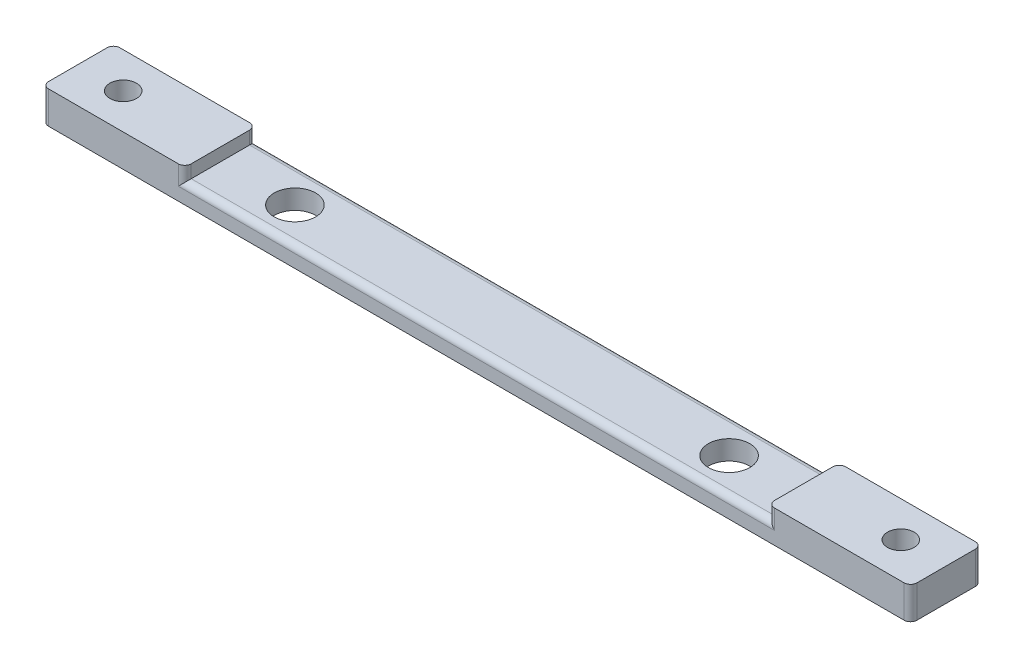
ISO-10303-21;
HEADER;
FILE_DESCRIPTION(('STEP AP214'),'2;1');
FILE_NAME('part.step','',(''),(''),'','','');
FILE_SCHEMA(('AUTOMOTIVE_DESIGN { 1 0 10303 214 1 1 1 1 }'));
ENDSEC;
DATA;
#1=APPLICATION_CONTEXT('core data for automotive mechanical design processes');
#2=APPLICATION_PROTOCOL_DEFINITION('international standard','automotive_design',2000,#1);
#3=PRODUCT_CONTEXT('',#1,'mechanical');
#4=PRODUCT('Part','Part','',(#3));
#5=PRODUCT_RELATED_PRODUCT_CATEGORY('part','',(#4));
#6=PRODUCT_DEFINITION_FORMATION('','',#4);
#7=PRODUCT_DEFINITION_CONTEXT('part definition',#1,'design');
#8=PRODUCT_DEFINITION('design','',#6,#7);
#9=PRODUCT_DEFINITION_SHAPE('','',#8);
#10=(LENGTH_UNIT() NAMED_UNIT(*) SI_UNIT(.MILLI.,.METRE.));
#11=(NAMED_UNIT(*) PLANE_ANGLE_UNIT() SI_UNIT($,.RADIAN.));
#12=(NAMED_UNIT(*) SI_UNIT($,.STERADIAN.) SOLID_ANGLE_UNIT());
#13=UNCERTAINTY_MEASURE_WITH_UNIT(LENGTH_MEASURE(1.E-05),#10,'distance_accuracy_value','');
#14=(GEOMETRIC_REPRESENTATION_CONTEXT(3) GLOBAL_UNCERTAINTY_ASSIGNED_CONTEXT((#13)) GLOBAL_UNIT_ASSIGNED_CONTEXT((#10,
#11,#12)) REPRESENTATION_CONTEXT('',''));
#15=CARTESIAN_POINT('',(0.,0.,0.));
#16=DIRECTION('',(0.,0.,1.));
#17=DIRECTION('',(1.,0.,0.));
#18=AXIS2_PLACEMENT_3D('',#15,#16,#17);
#19=CARTESIAN_POINT('',(66.,5.,-1.00000000000002));
#20=DIRECTION('',(0.,1.,0.));
#21=DIRECTION('',(0.,0.,1.));
#22=AXIS2_PLACEMENT_3D('',#19,#20,#21);
#23=PLANE('',#22);
#24=CARTESIAN_POINT('',(60.,5.,-5.50000000000002));
#25=DIRECTION('',(0.,1.,0.));
#26=DIRECTION('',(0.,0.,1.));
#27=AXIS2_PLACEMENT_3D('',#24,#25,#26);
#28=CIRCLE('',#27,2.04999999999999);
#29=CARTESIAN_POINT('',(60.,5.,-3.45000000000002));
#30=VERTEX_POINT('',#29);
#31=EDGE_CURVE('E255',#30,#30,#28,.T.);
#32=ORIENTED_EDGE('',*,*,#31,.F.);
#33=EDGE_LOOP('',(#32));
#34=FACE_BOUND('',#33,.T.);
#35=DIRECTION('',(-1.,0.,0.));
#36=VECTOR('',#35,1.);
#37=CARTESIAN_POINT('',(66.,5.,-11.));
#38=LINE('',#37,#36);
#39=CARTESIAN_POINT('',(66.,5.,-11.));
#40=VERTEX_POINT('',#39);
#41=CARTESIAN_POINT('',(46.,5.,-11.));
#42=VERTEX_POINT('',#41);
#43=EDGE_CURVE('E284',#40,#42,#38,.T.);
#44=ORIENTED_EDGE('',*,*,#43,.T.);
#45=CARTESIAN_POINT('',(46.,5.,-9.99999999999998));
#46=DIRECTION('',(0.,1.,0.));
#47=DIRECTION('',(0.,0.,1.));
#48=AXIS2_PLACEMENT_3D('',#45,#46,#47);
#49=CIRCLE('',#48,1.);
#50=CARTESIAN_POINT('',(45.,5.,-9.99999999999998));
#51=VERTEX_POINT('',#50);
#52=EDGE_CURVE('E204',#42,#51,#49,.T.);
#53=ORIENTED_EDGE('',*,*,#52,.T.);
#54=DIRECTION('',(0.,0.,1.));
#55=VECTOR('',#54,1.);
#56=CARTESIAN_POINT('',(45.,5.,-11.));
#57=LINE('',#56,#55);
#58=CARTESIAN_POINT('',(45.,5.,-1.00000000000002));
#59=VERTEX_POINT('',#58);
#60=EDGE_CURVE('E332',#51,#59,#57,.T.);
#61=ORIENTED_EDGE('',*,*,#60,.T.);
#62=CARTESIAN_POINT('',(46.,5.,-1.00000000000002));
#63=DIRECTION('',(0.,1.,0.));
#64=DIRECTION('',(0.,0.,1.));
#65=AXIS2_PLACEMENT_3D('',#62,#63,#64);
#66=CIRCLE('',#65,1.);
#67=CARTESIAN_POINT('',(46.,5.,0.));
#68=VERTEX_POINT('',#67);
#69=EDGE_CURVE('E202',#59,#68,#66,.T.);
#70=ORIENTED_EDGE('',*,*,#69,.T.);
#71=DIRECTION('',(1.,0.,0.));
#72=VECTOR('',#71,1.);
#73=CARTESIAN_POINT('',(-66.,5.,0.));
#74=LINE('',#73,#72);
#75=CARTESIAN_POINT('',(66.,5.,0.));
#76=VERTEX_POINT('',#75);
#77=EDGE_CURVE('E168',#68,#76,#74,.T.);
#78=ORIENTED_EDGE('',*,*,#77,.T.);
#79=CARTESIAN_POINT('',(66.,5.,-1.00000000000002));
#80=DIRECTION('',(0.,1.,0.));
#81=DIRECTION('',(0.,0.,1.));
#82=AXIS2_PLACEMENT_3D('',#79,#80,#81);
#83=CIRCLE('',#82,1.);
#84=CARTESIAN_POINT('',(67.,5.,-1.00000000000002));
#85=VERTEX_POINT('',#84);
#86=EDGE_CURVE('E163',#76,#85,#83,.T.);
#87=ORIENTED_EDGE('',*,*,#86,.T.);
#88=DIRECTION('',(0.,0.,-1.));
#89=VECTOR('',#88,1.);
#90=CARTESIAN_POINT('',(67.,5.,-1.00000000000002));
#91=LINE('',#90,#89);
#92=CARTESIAN_POINT('',(67.,5.,-9.99999999999998));
#93=VERTEX_POINT('',#92);
#94=EDGE_CURVE('E152',#85,#93,#91,.T.);
#95=ORIENTED_EDGE('',*,*,#94,.T.);
#96=CARTESIAN_POINT('',(66.,5.,-9.99999999999998));
#97=DIRECTION('',(0.,1.,0.));
#98=DIRECTION('',(0.,0.,1.));
#99=AXIS2_PLACEMENT_3D('',#96,#97,#98);
#100=CIRCLE('',#99,1.);
#101=EDGE_CURVE('E162',#93,#40,#100,.T.);
#102=ORIENTED_EDGE('',*,*,#101,.T.);
#103=EDGE_LOOP('',(#44,#53,#61,#70,#78,#87,#95,#102));
#104=FACE_BOUND('',#103,.T.);
#105=ADVANCED_FACE('F37',(#34,#104),#23,.T.);
#106=DIRECTION('',(0.,0.,1.));
#107=VECTOR('',#106,1.);
#108=CARTESIAN_POINT('',(-45.,5.,-11.));
#109=LINE('',#108,#107);
#110=CARTESIAN_POINT('',(-45.,5.,-9.99999999999998));
#111=VERTEX_POINT('',#110);
#112=CARTESIAN_POINT('',(-45.,5.,-1.00000000000002));
#113=VERTEX_POINT('',#112);
#114=EDGE_CURVE('E188',#111,#113,#109,.T.);
#115=ORIENTED_EDGE('',*,*,#114,.F.);
#116=CARTESIAN_POINT('',(-46.,5.,-9.99999999999998));
#117=DIRECTION('',(0.,1.,0.));
#118=DIRECTION('',(0.,0.,1.));
#119=AXIS2_PLACEMENT_3D('',#116,#117,#118);
#120=CIRCLE('',#119,1.);
#121=CARTESIAN_POINT('',(-46.,5.,-11.));
#122=VERTEX_POINT('',#121);
#123=EDGE_CURVE('E11',#111,#122,#120,.T.);
#124=ORIENTED_EDGE('',*,*,#123,.T.);
#125=CARTESIAN_POINT('',(-66.,5.,-11.));
#126=VERTEX_POINT('',#125);
#127=EDGE_CURVE('E306',#122,#126,#38,.T.);
#128=ORIENTED_EDGE('',*,*,#127,.T.);
#129=CARTESIAN_POINT('',(-66.,5.,-9.99999999999998));
#130=DIRECTION('',(0.,1.,0.));
#131=DIRECTION('',(0.,0.,-1.));
#132=AXIS2_PLACEMENT_3D('',#129,#130,#131);
#133=CIRCLE('',#132,1.);
#134=CARTESIAN_POINT('',(-67.,5.,-9.99999999999998));
#135=VERTEX_POINT('',#134);
#136=EDGE_CURVE('E302',#126,#135,#133,.T.);
#137=ORIENTED_EDGE('',*,*,#136,.T.);
#138=DIRECTION('',(0.,0.,1.));
#139=VECTOR('',#138,1.);
#140=CARTESIAN_POINT('',(-67.,5.,-1.00000000000002));
#141=LINE('',#140,#139);
#142=CARTESIAN_POINT('',(-67.,5.,-1.00000000000002));
#143=VERTEX_POINT('',#142);
#144=EDGE_CURVE('E301',#135,#143,#141,.T.);
#145=ORIENTED_EDGE('',*,*,#144,.T.);
#146=CARTESIAN_POINT('',(-66.,5.,-1.00000000000002));
#147=DIRECTION('',(0.,1.,0.));
#148=DIRECTION('',(0.,0.,-1.));
#149=AXIS2_PLACEMENT_3D('',#146,#147,#148);
#150=CIRCLE('',#149,1.);
#151=CARTESIAN_POINT('',(-66.,5.,0.));
#152=VERTEX_POINT('',#151);
#153=EDGE_CURVE('E244',#143,#152,#150,.T.);
#154=ORIENTED_EDGE('',*,*,#153,.T.);
#155=CARTESIAN_POINT('',(-46.,5.,0.));
#156=VERTEX_POINT('',#155);
#157=EDGE_CURVE('E240',#152,#156,#74,.T.);
#158=ORIENTED_EDGE('',*,*,#157,.T.);
#159=CARTESIAN_POINT('',(-46.,5.,-1.00000000000002));
#160=DIRECTION('',(0.,1.,0.));
#161=DIRECTION('',(0.,0.,1.));
#162=AXIS2_PLACEMENT_3D('',#159,#160,#161);
#163=CIRCLE('',#162,1.);
#164=EDGE_CURVE('E46',#156,#113,#163,.T.);
#165=ORIENTED_EDGE('',*,*,#164,.T.);
#166=EDGE_LOOP('',(#115,#124,#128,#137,#145,#154,#158,#165));
#167=FACE_BOUND('',#166,.T.);
#168=CARTESIAN_POINT('',(-60.,5.,-5.50000000000002));
#169=DIRECTION('',(0.,1.,0.));
#170=DIRECTION('',(0.,0.,-1.));
#171=AXIS2_PLACEMENT_3D('',#168,#169,#170);
#172=CIRCLE('',#171,2.04999999999999);
#173=CARTESIAN_POINT('',(-60.,5.,-7.55000000000001));
#174=VERTEX_POINT('',#173);
#175=EDGE_CURVE('E319',#174,#174,#172,.T.);
#176=ORIENTED_EDGE('',*,*,#175,.F.);
#177=EDGE_LOOP('',(#176));
#178=FACE_BOUND('',#177,.T.);
#179=ADVANCED_FACE('F241',(#167,#178),#23,.T.);
#180=CARTESIAN_POINT('',(66.,0.,-1.00000000000002));
#181=DIRECTION('',(0.,1.,0.));
#182=DIRECTION('',(0.,0.,1.));
#183=AXIS2_PLACEMENT_3D('',#180,#181,#182);
#184=PLANE('',#183);
#185=CARTESIAN_POINT('',(66.,0.,-1.00000000000002));
#186=DIRECTION('',(0.,1.,0.));
#187=DIRECTION('',(0.,0.,1.));
#188=AXIS2_PLACEMENT_3D('',#185,#186,#187);
#189=CIRCLE('',#188,1.);
#190=CARTESIAN_POINT('',(66.,0.,0.));
#191=VERTEX_POINT('',#190);
#192=CARTESIAN_POINT('',(67.,0.,-1.00000000000002));
#193=VERTEX_POINT('',#192);
#194=EDGE_CURVE('E176',#191,#193,#189,.T.);
#195=ORIENTED_EDGE('',*,*,#194,.F.);
#196=DIRECTION('',(1.,0.,0.));
#197=VECTOR('',#196,1.);
#198=CARTESIAN_POINT('',(-66.,0.,0.));
#199=LINE('',#198,#197);
#200=CARTESIAN_POINT('',(-66.,0.,0.));
#201=VERTEX_POINT('',#200);
#202=EDGE_CURVE('E172',#201,#191,#199,.T.);
#203=ORIENTED_EDGE('',*,*,#202,.F.);
#204=CARTESIAN_POINT('',(-66.,0.,-1.00000000000002));
#205=DIRECTION('',(0.,1.,0.));
#206=DIRECTION('',(0.,0.,-1.));
#207=AXIS2_PLACEMENT_3D('',#204,#205,#206);
#208=CIRCLE('',#207,1.);
#209=CARTESIAN_POINT('',(-67.,0.,-1.00000000000002));
#210=VERTEX_POINT('',#209);
#211=EDGE_CURVE('E265',#210,#201,#208,.T.);
#212=ORIENTED_EDGE('',*,*,#211,.F.);
#213=DIRECTION('',(0.,0.,1.));
#214=VECTOR('',#213,1.);
#215=CARTESIAN_POINT('',(-67.,0.,-1.00000000000002));
#216=LINE('',#215,#214);
#217=CARTESIAN_POINT('',(-67.,0.,-9.99999999999998));
#218=VERTEX_POINT('',#217);
#219=EDGE_CURVE('E263',#218,#210,#216,.T.);
#220=ORIENTED_EDGE('',*,*,#219,.F.);
#221=CARTESIAN_POINT('',(-66.,0.,-9.99999999999998));
#222=DIRECTION('',(0.,1.,0.));
#223=DIRECTION('',(0.,0.,-1.));
#224=AXIS2_PLACEMENT_3D('',#221,#222,#223);
#225=CIRCLE('',#224,1.);
#226=CARTESIAN_POINT('',(-66.,0.,-11.));
#227=VERTEX_POINT('',#226);
#228=EDGE_CURVE('E261',#227,#218,#225,.T.);
#229=ORIENTED_EDGE('',*,*,#228,.F.);
#230=DIRECTION('',(-1.,0.,0.));
#231=VECTOR('',#230,1.);
#232=CARTESIAN_POINT('',(66.,0.,-11.));
#233=LINE('',#232,#231);
#234=CARTESIAN_POINT('',(66.,0.,-11.));
#235=VERTEX_POINT('',#234);
#236=EDGE_CURVE('E259',#235,#227,#233,.T.);
#237=ORIENTED_EDGE('',*,*,#236,.F.);
#238=CARTESIAN_POINT('',(66.,0.,-9.99999999999998));
#239=DIRECTION('',(0.,1.,0.));
#240=DIRECTION('',(0.,0.,1.));
#241=AXIS2_PLACEMENT_3D('',#238,#239,#240);
#242=CIRCLE('',#241,1.);
#243=CARTESIAN_POINT('',(67.,0.,-9.99999999999998));
#244=VERTEX_POINT('',#243);
#245=EDGE_CURVE('E257',#244,#235,#242,.T.);
#246=ORIENTED_EDGE('',*,*,#245,.F.);
#247=DIRECTION('',(0.,0.,-1.));
#248=VECTOR('',#247,1.);
#249=CARTESIAN_POINT('',(67.,0.,-1.00000000000002));
#250=LINE('',#249,#248);
#251=EDGE_CURVE('E254',#193,#244,#250,.T.);
#252=ORIENTED_EDGE('',*,*,#251,.F.);
#253=EDGE_LOOP('',(#195,#203,#212,#220,#229,#237,#246,#252));
#254=FACE_BOUND('',#253,.T.);
#255=CARTESIAN_POINT('',(60.,0.,-5.50000000000002));
#256=DIRECTION('',(0.,1.,0.));
#257=DIRECTION('',(0.,0.,1.));
#258=AXIS2_PLACEMENT_3D('',#255,#256,#257);
#259=CIRCLE('',#258,2.04999999999999);
#260=CARTESIAN_POINT('',(60.,0.,-3.45000000000002));
#261=VERTEX_POINT('',#260);
#262=EDGE_CURVE('E308',#261,#261,#259,.T.);
#263=ORIENTED_EDGE('',*,*,#262,.T.);
#264=EDGE_LOOP('',(#263));
#265=FACE_BOUND('',#264,.T.);
#266=CARTESIAN_POINT('',(33.5,0.,-5.50000000000001));
#267=DIRECTION('',(0.,1.,0.));
#268=DIRECTION('',(0.,0.,1.));
#269=AXIS2_PLACEMENT_3D('',#266,#267,#268);
#270=CIRCLE('',#269,3.2);
#271=CARTESIAN_POINT('',(33.5,0.,-2.30000000000001));
#272=VERTEX_POINT('',#271);
#273=EDGE_CURVE('E311',#272,#272,#270,.T.);
#274=ORIENTED_EDGE('',*,*,#273,.T.);
#275=EDGE_LOOP('',(#274));
#276=FACE_BOUND('',#275,.T.);
#277=CARTESIAN_POINT('',(-33.5,0.,-5.50000000000001));
#278=DIRECTION('',(0.,1.,0.));
#279=DIRECTION('',(0.,0.,-1.));
#280=AXIS2_PLACEMENT_3D('',#277,#278,#279);
#281=CIRCLE('',#280,3.2);
#282=CARTESIAN_POINT('',(-33.5,0.,-8.70000000000002));
#283=VERTEX_POINT('',#282);
#284=EDGE_CURVE('E316',#283,#283,#281,.T.);
#285=ORIENTED_EDGE('',*,*,#284,.T.);
#286=EDGE_LOOP('',(#285));
#287=FACE_BOUND('',#286,.T.);
#288=CARTESIAN_POINT('',(-60.,0.,-5.50000000000002));
#289=DIRECTION('',(0.,1.,0.));
#290=DIRECTION('',(0.,0.,-1.));
#291=AXIS2_PLACEMENT_3D('',#288,#289,#290);
#292=CIRCLE('',#291,2.04999999999999);
#293=CARTESIAN_POINT('',(-60.,0.,-7.55000000000001));
#294=VERTEX_POINT('',#293);
#295=EDGE_CURVE('E320',#294,#294,#292,.T.);
#296=ORIENTED_EDGE('',*,*,#295,.T.);
#297=EDGE_LOOP('',(#296));
#298=FACE_BOUND('',#297,.T.);
#299=ADVANCED_FACE('F289',(#254,#265,#276,#287,#298),#184,.F.);
#300=CARTESIAN_POINT('',(66.,5.,-1.00000000000002));
#301=DIRECTION('',(0.,-1.,0.));
#302=DIRECTION('',(0.,0.,-1.));
#303=AXIS2_PLACEMENT_3D('',#300,#301,#302);
#304=CYLINDRICAL_SURFACE('',#303,1.);
#305=ORIENTED_EDGE('',*,*,#194,.T.);
#306=DIRECTION('',(0.,-1.,0.));
#307=VECTOR('',#306,1.);
#308=CARTESIAN_POINT('',(67.,5.,-1.00000000000002));
#309=LINE('',#308,#307);
#310=EDGE_CURVE('E156',#85,#193,#309,.T.);
#311=ORIENTED_EDGE('',*,*,#310,.F.);
#312=ORIENTED_EDGE('',*,*,#86,.F.);
#313=DIRECTION('',(0.,-1.,0.));
#314=VECTOR('',#313,1.);
#315=CARTESIAN_POINT('',(66.,5.,0.));
#316=LINE('',#315,#314);
#317=EDGE_CURVE('E246',#76,#191,#316,.T.);
#318=ORIENTED_EDGE('',*,*,#317,.T.);
#319=EDGE_LOOP('',(#305,#311,#312,#318));
#320=FACE_BOUND('',#319,.T.);
#321=ADVANCED_FACE('F174',(#320),#304,.T.);
#322=CARTESIAN_POINT('',(67.,5.,-1.00000000000002));
#323=DIRECTION('',(-1.,0.,0.));
#324=DIRECTION('',(0.,0.,1.));
#325=AXIS2_PLACEMENT_3D('',#322,#323,#324);
#326=PLANE('',#325);
#327=ORIENTED_EDGE('',*,*,#251,.T.);
#328=DIRECTION('',(0.,-1.,0.));
#329=VECTOR('',#328,1.);
#330=CARTESIAN_POINT('',(67.,5.,-9.99999999999998));
#331=LINE('',#330,#329);
#332=EDGE_CURVE('E159',#93,#244,#331,.T.);
#333=ORIENTED_EDGE('',*,*,#332,.F.);
#334=ORIENTED_EDGE('',*,*,#94,.F.);
#335=ORIENTED_EDGE('',*,*,#310,.T.);
#336=EDGE_LOOP('',(#327,#333,#334,#335));
#337=FACE_BOUND('',#336,.T.);
#338=ADVANCED_FACE('F154',(#337),#326,.F.);
#339=CARTESIAN_POINT('',(66.,5.,-9.99999999999998));
#340=DIRECTION('',(0.,-1.,0.));
#341=DIRECTION('',(0.,0.,-1.));
#342=AXIS2_PLACEMENT_3D('',#339,#340,#341);
#343=CYLINDRICAL_SURFACE('',#342,1.);
#344=ORIENTED_EDGE('',*,*,#245,.T.);
#345=DIRECTION('',(0.,-1.,0.));
#346=VECTOR('',#345,1.);
#347=CARTESIAN_POINT('',(66.,5.,-11.));
#348=LINE('',#347,#346);
#349=EDGE_CURVE('E181',#40,#235,#348,.T.);
#350=ORIENTED_EDGE('',*,*,#349,.F.);
#351=ORIENTED_EDGE('',*,*,#101,.F.);
#352=ORIENTED_EDGE('',*,*,#332,.T.);
#353=EDGE_LOOP('',(#344,#350,#351,#352));
#354=FACE_BOUND('',#353,.T.);
#355=ADVANCED_FACE('F359',(#354),#343,.T.);
#356=CARTESIAN_POINT('',(66.,5.,-11.));
#357=DIRECTION('',(0.,0.,1.));
#358=DIRECTION('',(1.,0.,0.));
#359=AXIS2_PLACEMENT_3D('',#356,#357,#358);
#360=PLANE('',#359);
#361=DIRECTION('',(1.,0.,0.));
#362=VECTOR('',#361,1.);
#363=CARTESIAN_POINT('',(66.,2.00000000000001,-11.));
#364=LINE('',#363,#362);
#365=CARTESIAN_POINT('',(-46.,2.,-11.));
#366=VERTEX_POINT('',#365);
#367=CARTESIAN_POINT('',(46.,2.00000000000001,-11.));
#368=VERTEX_POINT('',#367);
#369=EDGE_CURVE('E179',#366,#368,#364,.T.);
#370=ORIENTED_EDGE('',*,*,#369,.T.);
#371=DIRECTION('',(0.,-1.,0.));
#372=VECTOR('',#371,1.);
#373=CARTESIAN_POINT('',(46.,5.,-11.));
#374=LINE('',#373,#372);
#375=EDGE_CURVE('E192',#368,#42,#374,.F.);
#376=ORIENTED_EDGE('',*,*,#375,.T.);
#377=ORIENTED_EDGE('',*,*,#43,.F.);
#378=ORIENTED_EDGE('',*,*,#349,.T.);
#379=ORIENTED_EDGE('',*,*,#236,.T.);
#380=DIRECTION('',(0.,-1.,0.));
#381=VECTOR('',#380,1.);
#382=CARTESIAN_POINT('',(-66.,5.,-11.));
#383=LINE('',#382,#381);
#384=EDGE_CURVE('E275',#126,#227,#383,.T.);
#385=ORIENTED_EDGE('',*,*,#384,.F.);
#386=ORIENTED_EDGE('',*,*,#127,.F.);
#387=DIRECTION('',(0.,-1.,0.));
#388=VECTOR('',#387,1.);
#389=CARTESIAN_POINT('',(-46.,5.,-11.));
#390=LINE('',#389,#388);
#391=EDGE_CURVE('E177',#122,#366,#390,.T.);
#392=ORIENTED_EDGE('',*,*,#391,.T.);
#393=EDGE_LOOP('',(#370,#376,#377,#378,#379,#385,#386,#392));
#394=FACE_BOUND('',#393,.T.);
#395=ADVANCED_FACE('F282',(#394),#360,.F.);
#396=CARTESIAN_POINT('',(-66.,5.,-9.99999999999998));
#397=DIRECTION('',(0.,-1.,0.));
#398=DIRECTION('',(0.,0.,-1.));
#399=AXIS2_PLACEMENT_3D('',#396,#397,#398);
#400=CYLINDRICAL_SURFACE('',#399,1.);
#401=ORIENTED_EDGE('',*,*,#228,.T.);
#402=DIRECTION('',(0.,-1.,0.));
#403=VECTOR('',#402,1.);
#404=CARTESIAN_POINT('',(-67.,5.,-9.99999999999998));
#405=LINE('',#404,#403);
#406=EDGE_CURVE('E272',#135,#218,#405,.T.);
#407=ORIENTED_EDGE('',*,*,#406,.F.);
#408=ORIENTED_EDGE('',*,*,#136,.F.);
#409=ORIENTED_EDGE('',*,*,#384,.T.);
#410=EDGE_LOOP('',(#401,#407,#408,#409));
#411=FACE_BOUND('',#410,.T.);
#412=ADVANCED_FACE('F295',(#411),#400,.T.);
#413=CARTESIAN_POINT('',(-67.,5.,-1.00000000000002));
#414=DIRECTION('',(1.,0.,0.));
#415=DIRECTION('',(0.,0.,-1.));
#416=AXIS2_PLACEMENT_3D('',#413,#414,#415);
#417=PLANE('',#416);
#418=ORIENTED_EDGE('',*,*,#219,.T.);
#419=DIRECTION('',(0.,-1.,0.));
#420=VECTOR('',#419,1.);
#421=CARTESIAN_POINT('',(-67.,5.,-1.00000000000002));
#422=LINE('',#421,#420);
#423=EDGE_CURVE('E269',#143,#210,#422,.T.);
#424=ORIENTED_EDGE('',*,*,#423,.F.);
#425=ORIENTED_EDGE('',*,*,#144,.F.);
#426=ORIENTED_EDGE('',*,*,#406,.T.);
#427=EDGE_LOOP('',(#418,#424,#425,#426));
#428=FACE_BOUND('',#427,.T.);
#429=ADVANCED_FACE('F299',(#428),#417,.F.);
#430=CARTESIAN_POINT('',(-66.,5.,-1.00000000000002));
#431=DIRECTION('',(0.,-1.,0.));
#432=DIRECTION('',(0.,0.,-1.));
#433=AXIS2_PLACEMENT_3D('',#430,#431,#432);
#434=CYLINDRICAL_SURFACE('',#433,1.);
#435=ORIENTED_EDGE('',*,*,#211,.T.);
#436=DIRECTION('',(0.,-1.,0.));
#437=VECTOR('',#436,1.);
#438=CARTESIAN_POINT('',(-66.,5.,0.));
#439=LINE('',#438,#437);
#440=EDGE_CURVE('E248',#152,#201,#439,.T.);
#441=ORIENTED_EDGE('',*,*,#440,.F.);
#442=ORIENTED_EDGE('',*,*,#153,.F.);
#443=ORIENTED_EDGE('',*,*,#423,.T.);
#444=EDGE_LOOP('',(#435,#441,#442,#443));
#445=FACE_BOUND('',#444,.T.);
#446=ADVANCED_FACE('F383',(#445),#434,.T.);
#447=CARTESIAN_POINT('',(-66.,5.,0.));
#448=DIRECTION('',(0.,0.,-1.));
#449=DIRECTION('',(-1.,0.,0.));
#450=AXIS2_PLACEMENT_3D('',#447,#448,#449);
#451=PLANE('',#450);
#452=ORIENTED_EDGE('',*,*,#77,.F.);
#453=DIRECTION('',(0.,-1.,0.));
#454=VECTOR('',#453,1.);
#455=CARTESIAN_POINT('',(46.,3.00000000000001,0.));
#456=LINE('',#455,#454);
#457=CARTESIAN_POINT('',(46.,2.00000000000001,0.));
#458=VERTEX_POINT('',#457);
#459=EDGE_CURVE('E210',#68,#458,#456,.T.);
#460=ORIENTED_EDGE('',*,*,#459,.T.);
#461=DIRECTION('',(1.,0.,0.));
#462=VECTOR('',#461,1.);
#463=CARTESIAN_POINT('',(-66.,2.,0.));
#464=LINE('',#463,#462);
#465=CARTESIAN_POINT('',(-46.,2.,0.));
#466=VERTEX_POINT('',#465);
#467=EDGE_CURVE('E208',#458,#466,#464,.F.);
#468=ORIENTED_EDGE('',*,*,#467,.T.);
#469=DIRECTION('',(0.,-1.,0.));
#470=VECTOR('',#469,1.);
#471=CARTESIAN_POINT('',(-46.,5.,0.));
#472=LINE('',#471,#470);
#473=EDGE_CURVE('E206',#466,#156,#472,.F.);
#474=ORIENTED_EDGE('',*,*,#473,.T.);
#475=ORIENTED_EDGE('',*,*,#157,.F.);
#476=ORIENTED_EDGE('',*,*,#440,.T.);
#477=ORIENTED_EDGE('',*,*,#202,.T.);
#478=ORIENTED_EDGE('',*,*,#317,.F.);
#479=EDGE_LOOP('',(#452,#460,#468,#474,#475,#476,#477,#478));
#480=FACE_BOUND('',#479,.T.);
#481=ADVANCED_FACE('F238',(#480),#451,.F.);
#482=CARTESIAN_POINT('',(60.,5.,-5.50000000000002));
#483=DIRECTION('',(0.,-1.,0.));
#484=DIRECTION('',(0.,0.,-1.));
#485=AXIS2_PLACEMENT_3D('',#482,#483,#484);
#486=CYLINDRICAL_SURFACE('',#485,2.04999999999999);
#487=ORIENTED_EDGE('',*,*,#31,.T.);
#488=EDGE_LOOP('',(#487));
#489=FACE_BOUND('',#488,.T.);
#490=ORIENTED_EDGE('',*,*,#262,.F.);
#491=EDGE_LOOP('',(#490));
#492=FACE_BOUND('',#491,.T.);
#493=ADVANCED_FACE('F377',(#489,#492),#486,.F.);
#494=CARTESIAN_POINT('',(33.5,5.,-5.50000000000001));
#495=DIRECTION('',(0.,-1.,0.));
#496=DIRECTION('',(0.,0.,-1.));
#497=AXIS2_PLACEMENT_3D('',#494,#495,#496);
#498=CYLINDRICAL_SURFACE('',#497,3.2);
#499=CARTESIAN_POINT('',(33.5,3.00000000000001,-5.50000000000001));
#500=DIRECTION('',(0.,-1.,0.));
#501=DIRECTION('',(1.,0.,0.));
#502=AXIS2_PLACEMENT_3D('',#499,#500,#501);
#503=CIRCLE('',#502,3.2);
#504=CARTESIAN_POINT('',(36.7,3.00000000000001,-5.50000000000001));
#505=VERTEX_POINT('',#504);
#506=EDGE_CURVE('E187',#505,#505,#503,.T.);
#507=ORIENTED_EDGE('',*,*,#506,.F.);
#508=EDGE_LOOP('',(#507));
#509=FACE_BOUND('',#508,.T.);
#510=ORIENTED_EDGE('',*,*,#273,.F.);
#511=EDGE_LOOP('',(#510));
#512=FACE_BOUND('',#511,.T.);
#513=ADVANCED_FACE('F413',(#509,#512),#498,.F.);
#514=CARTESIAN_POINT('',(-33.5,5.,-5.50000000000001));
#515=DIRECTION('',(0.,-1.,0.));
#516=DIRECTION('',(0.,0.,-1.));
#517=AXIS2_PLACEMENT_3D('',#514,#515,#516);
#518=CYLINDRICAL_SURFACE('',#517,3.2);
#519=CARTESIAN_POINT('',(-33.5,3.,-5.50000000000001));
#520=DIRECTION('',(0.,-1.,0.));
#521=DIRECTION('',(1.,0.,0.));
#522=AXIS2_PLACEMENT_3D('',#519,#520,#521);
#523=CIRCLE('',#522,3.2);
#524=CARTESIAN_POINT('',(-30.3,3.,-5.50000000000001));
#525=VERTEX_POINT('',#524);
#526=EDGE_CURVE('E185',#525,#525,#523,.T.);
#527=ORIENTED_EDGE('',*,*,#526,.F.);
#528=EDGE_LOOP('',(#527));
#529=FACE_BOUND('',#528,.T.);
#530=ORIENTED_EDGE('',*,*,#284,.F.);
#531=EDGE_LOOP('',(#530));
#532=FACE_BOUND('',#531,.T.);
#533=ADVANCED_FACE('F421',(#529,#532),#518,.F.);
#534=CARTESIAN_POINT('',(-60.,5.,-5.50000000000002));
#535=DIRECTION('',(0.,-1.,0.));
#536=DIRECTION('',(0.,0.,-1.));
#537=AXIS2_PLACEMENT_3D('',#534,#535,#536);
#538=CYLINDRICAL_SURFACE('',#537,2.04999999999999);
#539=ORIENTED_EDGE('',*,*,#175,.T.);
#540=EDGE_LOOP('',(#539));
#541=FACE_BOUND('',#540,.T.);
#542=ORIENTED_EDGE('',*,*,#295,.F.);
#543=EDGE_LOOP('',(#542));
#544=FACE_BOUND('',#543,.T.);
#545=ADVANCED_FACE('F428',(#541,#544),#538,.F.);
#546=CARTESIAN_POINT('',(-45.,0.,-11.));
#547=DIRECTION('',(-1.,0.,0.));
#548=DIRECTION('',(0.,0.,1.));
#549=AXIS2_PLACEMENT_3D('',#546,#547,#548);
#550=PLANE('',#549);
#551=DIRECTION('',(0.,0.,1.));
#552=VECTOR('',#551,1.);
#553=CARTESIAN_POINT('',(-45.,3.,-11.));
#554=LINE('',#553,#552);
#555=CARTESIAN_POINT('',(-45.,3.,-9.99999999999998));
#556=VERTEX_POINT('',#555);
#557=CARTESIAN_POINT('',(-45.,3.,-1.00000000000002));
#558=VERTEX_POINT('',#557);
#559=EDGE_CURVE('E221',#556,#558,#554,.T.);
#560=ORIENTED_EDGE('',*,*,#559,.F.);
#561=DIRECTION('',(0.,-1.,0.));
#562=VECTOR('',#561,1.);
#563=CARTESIAN_POINT('',(-45.,0.,-9.99999999999998));
#564=LINE('',#563,#562);
#565=EDGE_CURVE('E60',#556,#111,#564,.F.);
#566=ORIENTED_EDGE('',*,*,#565,.T.);
#567=ORIENTED_EDGE('',*,*,#114,.T.);
#568=DIRECTION('',(0.,-1.,0.));
#569=VECTOR('',#568,1.);
#570=CARTESIAN_POINT('',(-45.,0.,-1.00000000000002));
#571=LINE('',#570,#569);
#572=EDGE_CURVE('E213',#113,#558,#571,.T.);
#573=ORIENTED_EDGE('',*,*,#572,.T.);
#574=EDGE_LOOP('',(#560,#566,#567,#573));
#575=FACE_BOUND('',#574,.T.);
#576=ADVANCED_FACE('F335',(#575),#550,.F.);
#577=CARTESIAN_POINT('',(45.,0.,-11.));
#578=DIRECTION('',(-1.,0.,0.));
#579=DIRECTION('',(0.,0.,1.));
#580=AXIS2_PLACEMENT_3D('',#577,#578,#579);
#581=PLANE('',#580);
#582=ORIENTED_EDGE('',*,*,#60,.F.);
#583=DIRECTION('',(0.,-1.,0.));
#584=VECTOR('',#583,1.);
#585=CARTESIAN_POINT('',(45.,3.00000000000001,-9.99999999999998));
#586=LINE('',#585,#584);
#587=CARTESIAN_POINT('',(45.,3.00000000000001,-9.99999999999998));
#588=VERTEX_POINT('',#587);
#589=EDGE_CURVE('E200',#51,#588,#586,.T.);
#590=ORIENTED_EDGE('',*,*,#589,.T.);
#591=DIRECTION('',(0.,0.,1.));
#592=VECTOR('',#591,1.);
#593=CARTESIAN_POINT('',(45.,3.00000000000001,-11.));
#594=LINE('',#593,#592);
#595=CARTESIAN_POINT('',(45.,3.00000000000001,-1.00000000000002));
#596=VERTEX_POINT('',#595);
#597=EDGE_CURVE('E329',#588,#596,#594,.T.);
#598=ORIENTED_EDGE('',*,*,#597,.T.);
#599=DIRECTION('',(0.,-1.,0.));
#600=VECTOR('',#599,1.);
#601=CARTESIAN_POINT('',(45.,5.,-1.00000000000002));
#602=LINE('',#601,#600);
#603=EDGE_CURVE('E198',#596,#59,#602,.F.);
#604=ORIENTED_EDGE('',*,*,#603,.T.);
#605=EDGE_LOOP('',(#582,#590,#598,#604));
#606=FACE_BOUND('',#605,.T.);
#607=ADVANCED_FACE('F355',(#606),#581,.T.);
#608=CARTESIAN_POINT('',(0.,3.00000000000001,-11.));
#609=DIRECTION('',(0.,-1.,0.));
#610=DIRECTION('',(1.,0.,0.));
#611=AXIS2_PLACEMENT_3D('',#608,#609,#610);
#612=PLANE('',#611);
#613=ORIENTED_EDGE('',*,*,#506,.T.);
#614=EDGE_LOOP('',(#613));
#615=FACE_BOUND('',#614,.T.);
#616=ORIENTED_EDGE('',*,*,#526,.T.);
#617=EDGE_LOOP('',(#616));
#618=FACE_BOUND('',#617,.T.);
#619=ORIENTED_EDGE('',*,*,#597,.F.);
#620=DIRECTION('',(1.,0.,0.));
#621=VECTOR('',#620,1.);
#622=CARTESIAN_POINT('',(0.,3.00000000000001,-9.99999999999998));
#623=LINE('',#622,#621);
#624=EDGE_CURVE('E196',#588,#556,#623,.F.);
#625=ORIENTED_EDGE('',*,*,#624,.T.);
#626=ORIENTED_EDGE('',*,*,#559,.T.);
#627=DIRECTION('',(1.,0.,0.));
#628=VECTOR('',#627,1.);
#629=CARTESIAN_POINT('',(0.,3.00000000000001,-1.00000000000002));
#630=LINE('',#629,#628);
#631=EDGE_CURVE('E194',#558,#596,#630,.T.);
#632=ORIENTED_EDGE('',*,*,#631,.T.);
#633=EDGE_LOOP('',(#619,#625,#626,#632));
#634=FACE_BOUND('',#633,.T.);
#635=ADVANCED_FACE('F447',(#615,#618,#634),#612,.F.);
#636=CARTESIAN_POINT('',(-46.,5.,-9.99999999999998));
#637=DIRECTION('',(0.,-1.,0.));
#638=DIRECTION('',(0.,0.,-1.));
#639=AXIS2_PLACEMENT_3D('',#636,#637,#638);
#640=CYLINDRICAL_SURFACE('',#639,1.);
#641=ORIENTED_EDGE('',*,*,#123,.F.);
#642=ORIENTED_EDGE('',*,*,#565,.F.);
#643=CARTESIAN_POINT('',(-46.,2.,-9.99999999999998));
#644=DIRECTION('',(0.707106781186548,-0.707106781186547,0.));
#645=DIRECTION('',(0.707106781186547,0.707106781186548,0.));
#646=AXIS2_PLACEMENT_3D('',#643,#644,#645);
#647=ELLIPSE('',#646,1.4142135623731,1.);
#648=EDGE_CURVE('E219',#366,#556,#647,.T.);
#649=ORIENTED_EDGE('',*,*,#648,.F.);
#650=ORIENTED_EDGE('',*,*,#391,.F.);
#651=EDGE_LOOP('',(#641,#642,#649,#650));
#652=FACE_BOUND('',#651,.T.);
#653=ADVANCED_FACE('F340',(#652),#640,.T.);
#654=CARTESIAN_POINT('',(46.,0.,-9.99999999999998));
#655=DIRECTION('',(0.,1.,0.));
#656=DIRECTION('',(0.,0.,1.));
#657=AXIS2_PLACEMENT_3D('',#654,#655,#656);
#658=CYLINDRICAL_SURFACE('',#657,1.);
#659=ORIENTED_EDGE('',*,*,#52,.F.);
#660=ORIENTED_EDGE('',*,*,#375,.F.);
#661=CARTESIAN_POINT('',(46.,2.00000000000001,-9.99999999999998));
#662=DIRECTION('',(0.707106781186547,0.707106781186548,0.));
#663=DIRECTION('',(0.707106781186548,-0.707106781186547,0.));
#664=AXIS2_PLACEMENT_3D('',#661,#662,#663);
#665=ELLIPSE('',#664,1.41421356237309,1.);
#666=EDGE_CURVE('E217',#588,#368,#665,.F.);
#667=ORIENTED_EDGE('',*,*,#666,.F.);
#668=ORIENTED_EDGE('',*,*,#589,.F.);
#669=EDGE_LOOP('',(#659,#660,#667,#668));
#670=FACE_BOUND('',#669,.T.);
#671=ADVANCED_FACE('F351',(#670),#658,.T.);
#672=CARTESIAN_POINT('',(66.,2.00000000000001,-9.99999999999998));
#673=DIRECTION('',(1.,0.,0.));
#674=DIRECTION('',(0.,1.,0.));
#675=AXIS2_PLACEMENT_3D('',#672,#673,#674);
#676=CYLINDRICAL_SURFACE('',#675,1.);
#677=ORIENTED_EDGE('',*,*,#648,.T.);
#678=ORIENTED_EDGE('',*,*,#624,.F.);
#679=ORIENTED_EDGE('',*,*,#666,.T.);
#680=ORIENTED_EDGE('',*,*,#369,.F.);
#681=EDGE_LOOP('',(#677,#678,#679,#680));
#682=FACE_BOUND('',#681,.T.);
#683=ADVANCED_FACE('F345',(#682),#676,.T.);
#684=CARTESIAN_POINT('',(-46.,0.,-1.00000000000002));
#685=DIRECTION('',(0.,-1.,0.));
#686=DIRECTION('',(0.,0.,-1.));
#687=AXIS2_PLACEMENT_3D('',#684,#685,#686);
#688=CYLINDRICAL_SURFACE('',#687,1.);
#689=ORIENTED_EDGE('',*,*,#164,.F.);
#690=ORIENTED_EDGE('',*,*,#473,.F.);
#691=CARTESIAN_POINT('',(-46.,2.,-1.00000000000002));
#692=DIRECTION('',(0.707106781186548,-0.707106781186547,0.));
#693=DIRECTION('',(0.707106781186547,0.707106781186548,0.));
#694=AXIS2_PLACEMENT_3D('',#691,#692,#693);
#695=ELLIPSE('',#694,1.4142135623731,1.);
#696=EDGE_CURVE('E41',#558,#466,#695,.T.);
#697=ORIENTED_EDGE('',*,*,#696,.F.);
#698=ORIENTED_EDGE('',*,*,#572,.F.);
#699=EDGE_LOOP('',(#689,#690,#697,#698));
#700=FACE_BOUND('',#699,.T.);
#701=ADVANCED_FACE('F39',(#700),#688,.T.);
#702=CARTESIAN_POINT('',(0.,2.00000000000001,-1.00000000000002));
#703=DIRECTION('',(1.,0.,0.));
#704=DIRECTION('',(0.,1.,0.));
#705=AXIS2_PLACEMENT_3D('',#702,#703,#704);
#706=CYLINDRICAL_SURFACE('',#705,1.);
#707=ORIENTED_EDGE('',*,*,#696,.T.);
#708=ORIENTED_EDGE('',*,*,#467,.F.);
#709=CARTESIAN_POINT('',(46.,2.00000000000001,-1.00000000000002));
#710=DIRECTION('',(0.707106781186547,0.707106781186548,0.));
#711=DIRECTION('',(-0.707106781186548,0.707106781186547,0.));
#712=AXIS2_PLACEMENT_3D('',#709,#710,#711);
#713=ELLIPSE('',#712,1.41421356237309,1.);
#714=EDGE_CURVE('E222',#596,#458,#713,.T.);
#715=ORIENTED_EDGE('',*,*,#714,.F.);
#716=ORIENTED_EDGE('',*,*,#631,.F.);
#717=EDGE_LOOP('',(#707,#708,#715,#716));
#718=FACE_BOUND('',#717,.T.);
#719=ADVANCED_FACE('F232',(#718),#706,.T.);
#720=CARTESIAN_POINT('',(46.,5.,-1.00000000000002));
#721=DIRECTION('',(0.,1.,0.));
#722=DIRECTION('',(0.,0.,1.));
#723=AXIS2_PLACEMENT_3D('',#720,#721,#722);
#724=CYLINDRICAL_SURFACE('',#723,1.);
#725=ORIENTED_EDGE('',*,*,#69,.F.);
#726=ORIENTED_EDGE('',*,*,#603,.F.);
#727=ORIENTED_EDGE('',*,*,#714,.T.);
#728=ORIENTED_EDGE('',*,*,#459,.F.);
#729=EDGE_LOOP('',(#725,#726,#727,#728));
#730=FACE_BOUND('',#729,.T.);
#731=ADVANCED_FACE('F357',(#730),#724,.T.);
#732=CLOSED_SHELL('',(#105,#179,#299,#321,#338,#355,#395,#412,#429,#446,#481,#493,#513,#533,
#545,#576,#607,#635,#653,#671,#683,#701,#719,#731));
#733=MANIFOLD_SOLID_BREP('B2',#732);
#734=ADVANCED_BREP_SHAPE_REPRESENTATION('',(#18,#733),#14);
#735=SHAPE_DEFINITION_REPRESENTATION(#9,#734);
ENDSEC;
END-ISO-10303-21;
